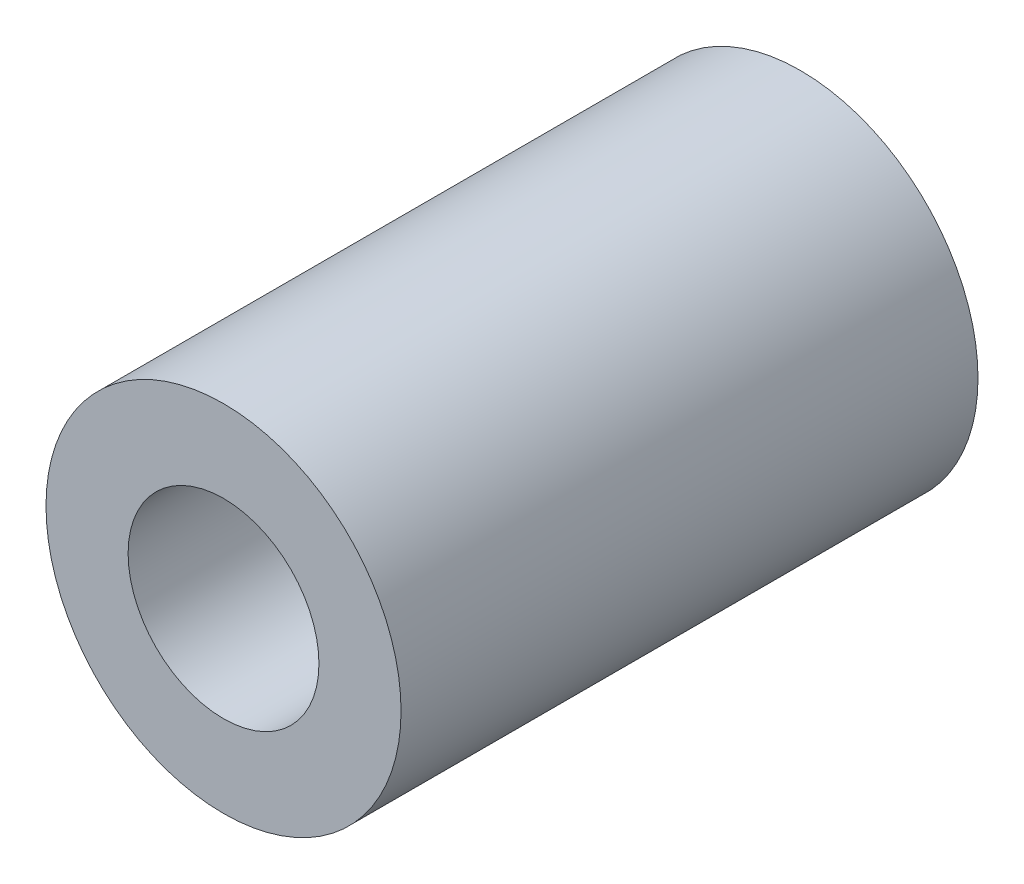
ISO-10303-21;
HEADER;
FILE_DESCRIPTION(('STEP AP214'),'2;1');
FILE_NAME('part.step','',(''),(''),'','','');
FILE_SCHEMA(('AUTOMOTIVE_DESIGN { 1 0 10303 214 1 1 1 1 }'));
ENDSEC;
DATA;
#1=APPLICATION_CONTEXT('core data for automotive mechanical design processes');
#2=APPLICATION_PROTOCOL_DEFINITION('international standard','automotive_design',2000,#1);
#3=PRODUCT_CONTEXT('',#1,'mechanical');
#4=PRODUCT('Part','Part','',(#3));
#5=PRODUCT_RELATED_PRODUCT_CATEGORY('part','',(#4));
#6=PRODUCT_DEFINITION_FORMATION('','',#4);
#7=PRODUCT_DEFINITION_CONTEXT('part definition',#1,'design');
#8=PRODUCT_DEFINITION('design','',#6,#7);
#9=PRODUCT_DEFINITION_SHAPE('','',#8);
#10=(LENGTH_UNIT() NAMED_UNIT(*) SI_UNIT(.MILLI.,.METRE.));
#11=(NAMED_UNIT(*) PLANE_ANGLE_UNIT() SI_UNIT($,.RADIAN.));
#12=(NAMED_UNIT(*) SI_UNIT($,.STERADIAN.) SOLID_ANGLE_UNIT());
#13=UNCERTAINTY_MEASURE_WITH_UNIT(LENGTH_MEASURE(1.E-05),#10,'distance_accuracy_value','');
#14=(GEOMETRIC_REPRESENTATION_CONTEXT(3) GLOBAL_UNCERTAINTY_ASSIGNED_CONTEXT((#13)) GLOBAL_UNIT_ASSIGNED_CONTEXT((#10,
#11,#12)) REPRESENTATION_CONTEXT('',''));
#15=CARTESIAN_POINT('',(0.,0.,0.));
#16=DIRECTION('',(0.,0.,1.));
#17=DIRECTION('',(1.,0.,0.));
#18=AXIS2_PLACEMENT_3D('',#15,#16,#17);
#19=CARTESIAN_POINT('',(0.,0.,13.));
#20=DIRECTION('',(0.,0.,1.));
#21=DIRECTION('',(1.,0.,0.));
#22=AXIS2_PLACEMENT_3D('',#19,#20,#21);
#23=PLANE('',#22);
#24=CARTESIAN_POINT('',(0.,0.,13.));
#25=DIRECTION('',(0.,0.,1.));
#26=DIRECTION('',(1.,0.,0.));
#27=AXIS2_PLACEMENT_3D('',#24,#25,#26);
#28=CIRCLE('',#27,4.);
#29=CARTESIAN_POINT('',(-4.,0.,13.));
#30=VERTEX_POINT('',#29);
#31=EDGE_CURVE('E10',#30,#30,#28,.T.);
#32=ORIENTED_EDGE('',*,*,#31,.T.);
#33=EDGE_LOOP('',(#32));
#34=FACE_BOUND('',#33,.T.);
#35=CARTESIAN_POINT('',(0.,0.,13.));
#36=DIRECTION('',(0.,0.,1.));
#37=DIRECTION('',(1.,0.,0.));
#38=AXIS2_PLACEMENT_3D('',#35,#36,#37);
#39=CIRCLE('',#38,2.15);
#40=CARTESIAN_POINT('',(-2.15,0.,13.));
#41=VERTEX_POINT('',#40);
#42=EDGE_CURVE('E48',#41,#41,#39,.T.);
#43=ORIENTED_EDGE('',*,*,#42,.F.);
#44=EDGE_LOOP('',(#43));
#45=FACE_BOUND('',#44,.T.);
#46=ADVANCED_FACE('F40',(#34,#45),#23,.T.);
#47=CARTESIAN_POINT('',(0.,0.,0.));
#48=DIRECTION('',(0.,0.,1.));
#49=DIRECTION('',(1.,0.,0.));
#50=AXIS2_PLACEMENT_3D('',#47,#48,#49);
#51=PLANE('',#50);
#52=CARTESIAN_POINT('',(0.,0.,0.));
#53=DIRECTION('',(0.,0.,1.));
#54=DIRECTION('',(1.,0.,0.));
#55=AXIS2_PLACEMENT_3D('',#52,#53,#54);
#56=CIRCLE('',#55,4.);
#57=CARTESIAN_POINT('',(-4.,0.,0.));
#58=VERTEX_POINT('',#57);
#59=EDGE_CURVE('E41',#58,#58,#56,.T.);
#60=ORIENTED_EDGE('',*,*,#59,.F.);
#61=EDGE_LOOP('',(#60));
#62=FACE_BOUND('',#61,.T.);
#63=CARTESIAN_POINT('',(0.,0.,0.));
#64=DIRECTION('',(0.,0.,1.));
#65=DIRECTION('',(1.,0.,0.));
#66=AXIS2_PLACEMENT_3D('',#63,#64,#65);
#67=CIRCLE('',#66,2.15);
#68=CARTESIAN_POINT('',(-2.15,0.,0.));
#69=VERTEX_POINT('',#68);
#70=EDGE_CURVE('E49',#69,#69,#67,.T.);
#71=ORIENTED_EDGE('',*,*,#70,.T.);
#72=EDGE_LOOP('',(#71));
#73=FACE_BOUND('',#72,.T.);
#74=ADVANCED_FACE('F58',(#62,#73),#51,.F.);
#75=CARTESIAN_POINT('',(0.,0.,13.));
#76=DIRECTION('',(0.,0.,-1.));
#77=DIRECTION('',(-1.,0.,0.));
#78=AXIS2_PLACEMENT_3D('',#75,#76,#77);
#79=CYLINDRICAL_SURFACE('',#78,4.);
#80=CARTESIAN_POINT('',(-4.,0.,13.));
#81=CARTESIAN_POINT('',(-4.,0.,12.8645833333333));
#82=CARTESIAN_POINT('',(-4.,0.,12.7291666666667));
#83=CARTESIAN_POINT('',(-4.,0.,12.4583333333333));
#84=CARTESIAN_POINT('',(-4.,0.,12.3229166666667));
#85=CARTESIAN_POINT('',(-4.,0.,12.0520833333333));
#86=CARTESIAN_POINT('',(-4.,0.,11.9166666666667));
#87=CARTESIAN_POINT('',(-4.,0.,11.6458333333333));
#88=CARTESIAN_POINT('',(-4.,0.,11.5104166666667));
#89=CARTESIAN_POINT('',(-4.,0.,11.2395833333333));
#90=CARTESIAN_POINT('',(-4.,0.,11.1041666666667));
#91=CARTESIAN_POINT('',(-4.,0.,10.8333333333333));
#92=CARTESIAN_POINT('',(-4.,0.,10.6979166666667));
#93=CARTESIAN_POINT('',(-4.,0.,10.4270833333333));
#94=CARTESIAN_POINT('',(-4.,0.,10.2916666666667));
#95=CARTESIAN_POINT('',(-4.,0.,10.0208333333333));
#96=CARTESIAN_POINT('',(-4.,0.,9.88541666666667));
#97=CARTESIAN_POINT('',(-4.,0.,9.61458333333333));
#98=CARTESIAN_POINT('',(-4.,0.,9.47916666666667));
#99=CARTESIAN_POINT('',(-4.,0.,9.20833333333333));
#100=CARTESIAN_POINT('',(-4.,0.,9.07291666666667));
#101=CARTESIAN_POINT('',(-4.,0.,8.80208333333333));
#102=CARTESIAN_POINT('',(-4.,0.,8.66666666666667));
#103=CARTESIAN_POINT('',(-4.,0.,8.39583333333333));
#104=CARTESIAN_POINT('',(-4.,0.,8.26041666666667));
#105=CARTESIAN_POINT('',(-4.,0.,7.98958333333333));
#106=CARTESIAN_POINT('',(-4.,0.,7.85416666666667));
#107=CARTESIAN_POINT('',(-4.,0.,7.58333333333333));
#108=CARTESIAN_POINT('',(-4.,0.,7.44791666666667));
#109=CARTESIAN_POINT('',(-4.,0.,7.17708333333333));
#110=CARTESIAN_POINT('',(-4.,0.,7.04166666666667));
#111=CARTESIAN_POINT('',(-4.,0.,6.77083333333333));
#112=CARTESIAN_POINT('',(-4.,0.,6.63541666666667));
#113=CARTESIAN_POINT('',(-4.,0.,6.36458333333333));
#114=CARTESIAN_POINT('',(-4.,0.,6.22916666666667));
#115=CARTESIAN_POINT('',(-4.,0.,5.95833333333333));
#116=CARTESIAN_POINT('',(-4.,0.,5.82291666666667));
#117=CARTESIAN_POINT('',(-4.,0.,5.55208333333333));
#118=CARTESIAN_POINT('',(-4.,0.,5.41666666666667));
#119=CARTESIAN_POINT('',(-4.,0.,5.14583333333333));
#120=CARTESIAN_POINT('',(-4.,0.,5.01041666666667));
#121=CARTESIAN_POINT('',(-4.,0.,4.73958333333333));
#122=CARTESIAN_POINT('',(-4.,0.,4.60416666666667));
#123=CARTESIAN_POINT('',(-4.,0.,4.33333333333333));
#124=CARTESIAN_POINT('',(-4.,0.,4.19791666666667));
#125=CARTESIAN_POINT('',(-4.,0.,3.92708333333333));
#126=CARTESIAN_POINT('',(-4.,0.,3.79166666666667));
#127=CARTESIAN_POINT('',(-4.,0.,3.52083333333333));
#128=CARTESIAN_POINT('',(-4.,0.,3.38541666666667));
#129=CARTESIAN_POINT('',(-4.,0.,3.11458333333333));
#130=CARTESIAN_POINT('',(-4.,0.,2.97916666666667));
#131=CARTESIAN_POINT('',(-4.,0.,2.70833333333333));
#132=CARTESIAN_POINT('',(-4.,0.,2.57291666666667));
#133=CARTESIAN_POINT('',(-4.,0.,2.30208333333333));
#134=CARTESIAN_POINT('',(-4.,0.,2.16666666666667));
#135=CARTESIAN_POINT('',(-4.,0.,1.89583333333333));
#136=CARTESIAN_POINT('',(-4.,0.,1.76041666666667));
#137=CARTESIAN_POINT('',(-4.,0.,1.48958333333333));
#138=CARTESIAN_POINT('',(-4.,0.,1.35416666666667));
#139=CARTESIAN_POINT('',(-4.,0.,1.08333333333333));
#140=CARTESIAN_POINT('',(-4.,0.,0.947916666666667));
#141=CARTESIAN_POINT('',(-4.,0.,0.677083333333334));
#142=CARTESIAN_POINT('',(-4.,0.,0.541666666666667));
#143=CARTESIAN_POINT('',(-4.,0.,0.270833333333334));
#144=CARTESIAN_POINT('',(-4.,0.,0.135416666666667));
#145=CARTESIAN_POINT('',(-4.,0.,0.));
#146=B_SPLINE_CURVE_WITH_KNOTS('',3,(#80,#81,#82,#83,#84,#85,#86,#87,#88,#89,#90,#91,#92,#93,
#94,#95,#96,#97,#98,#99,#100,#101,#102,#103,#104,#105,#106,#107,#108,#109,#110,#111,#112,#113,
#114,#115,#116,#117,#118,#119,#120,#121,#122,#123,#124,#125,#126,#127,#128,#129,#130,#131,#132,
#133,#134,#135,#136,#137,#138,#139,#140,#141,#142,#143,#144,#145),.UNSPECIFIED.,.F.,.F.,(4,2,2,
2,2,2,2,2,2,2,2,2,2,2,2,2,2,2,2,2,2,2,2,2,2,2,2,2,2,2,2,2,4),(0.,0.406249999999999,
0.812499999999999,1.21875,1.625,2.03125,2.4375,2.84375,3.25,3.65625,4.0625,4.46875,4.875,
5.28125,5.6875,6.09375,6.5,6.90625,7.3125,7.71875,8.125,8.53125,8.9375,9.34375,9.75,10.15625,
10.5625,10.96875,11.375,11.78125,12.1875,12.59375,13.),.UNSPECIFIED.);
#147=EDGE_CURVE('BSEAM39',#30,#58,#146,.T.);
#148=ORIENTED_EDGE('',*,*,#31,.F.);
#149=ORIENTED_EDGE('',*,*,#59,.T.);
#150=ORIENTED_EDGE('',*,*,#147,.T.);
#151=ORIENTED_EDGE('',*,*,#147,.F.);
#152=EDGE_LOOP('',(#148,#150,#149,#151));
#153=FACE_BOUND('',#152,.T.);
#154=ADVANCED_FACE('F39',(#153),#79,.T.);
#155=CARTESIAN_POINT('',(0.,0.,13.));
#156=DIRECTION('',(0.,0.,-1.));
#157=DIRECTION('',(-1.,0.,0.));
#158=AXIS2_PLACEMENT_3D('',#155,#156,#157);
#159=CYLINDRICAL_SURFACE('',#158,2.15);
#160=CARTESIAN_POINT('',(-2.15,0.,13.));
#161=CARTESIAN_POINT('',(-2.15,0.,12.8645833333333));
#162=CARTESIAN_POINT('',(-2.15,0.,12.7291666666667));
#163=CARTESIAN_POINT('',(-2.15,0.,12.4583333333333));
#164=CARTESIAN_POINT('',(-2.15,0.,12.3229166666667));
#165=CARTESIAN_POINT('',(-2.15,0.,12.0520833333333));
#166=CARTESIAN_POINT('',(-2.15,0.,11.9166666666667));
#167=CARTESIAN_POINT('',(-2.15,0.,11.6458333333333));
#168=CARTESIAN_POINT('',(-2.15,0.,11.5104166666667));
#169=CARTESIAN_POINT('',(-2.15,0.,11.2395833333333));
#170=CARTESIAN_POINT('',(-2.15,0.,11.1041666666667));
#171=CARTESIAN_POINT('',(-2.15,0.,10.8333333333333));
#172=CARTESIAN_POINT('',(-2.15,0.,10.6979166666667));
#173=CARTESIAN_POINT('',(-2.15,0.,10.4270833333333));
#174=CARTESIAN_POINT('',(-2.15,0.,10.2916666666667));
#175=CARTESIAN_POINT('',(-2.15,0.,10.0208333333333));
#176=CARTESIAN_POINT('',(-2.15,0.,9.88541666666667));
#177=CARTESIAN_POINT('',(-2.15,0.,9.61458333333333));
#178=CARTESIAN_POINT('',(-2.15,0.,9.47916666666667));
#179=CARTESIAN_POINT('',(-2.15,0.,9.20833333333333));
#180=CARTESIAN_POINT('',(-2.15,0.,9.07291666666667));
#181=CARTESIAN_POINT('',(-2.15,0.,8.80208333333333));
#182=CARTESIAN_POINT('',(-2.15,0.,8.66666666666667));
#183=CARTESIAN_POINT('',(-2.15,0.,8.39583333333333));
#184=CARTESIAN_POINT('',(-2.15,0.,8.26041666666667));
#185=CARTESIAN_POINT('',(-2.15,0.,7.98958333333333));
#186=CARTESIAN_POINT('',(-2.15,0.,7.85416666666667));
#187=CARTESIAN_POINT('',(-2.15,0.,7.58333333333333));
#188=CARTESIAN_POINT('',(-2.15,0.,7.44791666666667));
#189=CARTESIAN_POINT('',(-2.15,0.,7.17708333333333));
#190=CARTESIAN_POINT('',(-2.15,0.,7.04166666666667));
#191=CARTESIAN_POINT('',(-2.15,0.,6.77083333333333));
#192=CARTESIAN_POINT('',(-2.15,0.,6.63541666666667));
#193=CARTESIAN_POINT('',(-2.15,0.,6.36458333333333));
#194=CARTESIAN_POINT('',(-2.15,0.,6.22916666666667));
#195=CARTESIAN_POINT('',(-2.15,0.,5.95833333333333));
#196=CARTESIAN_POINT('',(-2.15,0.,5.82291666666667));
#197=CARTESIAN_POINT('',(-2.15,0.,5.55208333333333));
#198=CARTESIAN_POINT('',(-2.15,0.,5.41666666666667));
#199=CARTESIAN_POINT('',(-2.15,0.,5.14583333333333));
#200=CARTESIAN_POINT('',(-2.15,0.,5.01041666666667));
#201=CARTESIAN_POINT('',(-2.15,0.,4.73958333333333));
#202=CARTESIAN_POINT('',(-2.15,0.,4.60416666666667));
#203=CARTESIAN_POINT('',(-2.15,0.,4.33333333333333));
#204=CARTESIAN_POINT('',(-2.15,0.,4.19791666666667));
#205=CARTESIAN_POINT('',(-2.15,0.,3.92708333333333));
#206=CARTESIAN_POINT('',(-2.15,0.,3.79166666666667));
#207=CARTESIAN_POINT('',(-2.15,0.,3.52083333333333));
#208=CARTESIAN_POINT('',(-2.15,0.,3.38541666666667));
#209=CARTESIAN_POINT('',(-2.15,0.,3.11458333333333));
#210=CARTESIAN_POINT('',(-2.15,0.,2.97916666666667));
#211=CARTESIAN_POINT('',(-2.15,0.,2.70833333333333));
#212=CARTESIAN_POINT('',(-2.15,0.,2.57291666666667));
#213=CARTESIAN_POINT('',(-2.15,0.,2.30208333333333));
#214=CARTESIAN_POINT('',(-2.15,0.,2.16666666666667));
#215=CARTESIAN_POINT('',(-2.15,0.,1.89583333333333));
#216=CARTESIAN_POINT('',(-2.15,0.,1.76041666666667));
#217=CARTESIAN_POINT('',(-2.15,0.,1.48958333333333));
#218=CARTESIAN_POINT('',(-2.15,0.,1.35416666666667));
#219=CARTESIAN_POINT('',(-2.15,0.,1.08333333333333));
#220=CARTESIAN_POINT('',(-2.15,0.,0.947916666666667));
#221=CARTESIAN_POINT('',(-2.15,0.,0.677083333333334));
#222=CARTESIAN_POINT('',(-2.15,0.,0.541666666666667));
#223=CARTESIAN_POINT('',(-2.15,0.,0.270833333333334));
#224=CARTESIAN_POINT('',(-2.15,0.,0.135416666666667));
#225=CARTESIAN_POINT('',(-2.15,0.,0.));
#226=B_SPLINE_CURVE_WITH_KNOTS('',3,(#160,#161,#162,#163,#164,#165,#166,#167,#168,#169,#170,
#171,#172,#173,#174,#175,#176,#177,#178,#179,#180,#181,#182,#183,#184,#185,#186,#187,#188,#189,
#190,#191,#192,#193,#194,#195,#196,#197,#198,#199,#200,#201,#202,#203,#204,#205,#206,#207,#208,
#209,#210,#211,#212,#213,#214,#215,#216,#217,#218,#219,#220,#221,#222,#223,#224,#225),
.UNSPECIFIED.,.F.,.F.,(4,2,2,2,2,2,2,2,2,2,2,2,2,2,2,2,2,2,2,2,2,2,2,2,2,2,2,2,2,2,2,2,4),(0.,
0.406249999999999,0.812499999999999,1.21875,1.625,2.03125,2.4375,2.84375,3.25,3.65625,4.0625,
4.46875,4.875,5.28125,5.6875,6.09375,6.5,6.90625,7.3125,7.71875,8.125,8.53125,8.9375,9.34375,
9.75,10.15625,10.5625,10.96875,11.375,11.78125,12.1875,12.59375,13.),.UNSPECIFIED.);
#227=EDGE_CURVE('BSEAM57',#41,#69,#226,.T.);
#228=ORIENTED_EDGE('',*,*,#42,.T.);
#229=ORIENTED_EDGE('',*,*,#70,.F.);
#230=ORIENTED_EDGE('',*,*,#227,.T.);
#231=ORIENTED_EDGE('',*,*,#227,.F.);
#232=EDGE_LOOP('',(#228,#230,#229,#231));
#233=FACE_BOUND('',#232,.T.);
#234=ADVANCED_FACE('F57',(#233),#159,.F.);
#235=CLOSED_SHELL('',(#46,#74,#154,#234));
#236=MANIFOLD_SOLID_BREP('B2',#235);
#237=ADVANCED_BREP_SHAPE_REPRESENTATION('',(#18,#236),#14);
#238=SHAPE_DEFINITION_REPRESENTATION(#9,#237);
ENDSEC;
END-ISO-10303-21;
